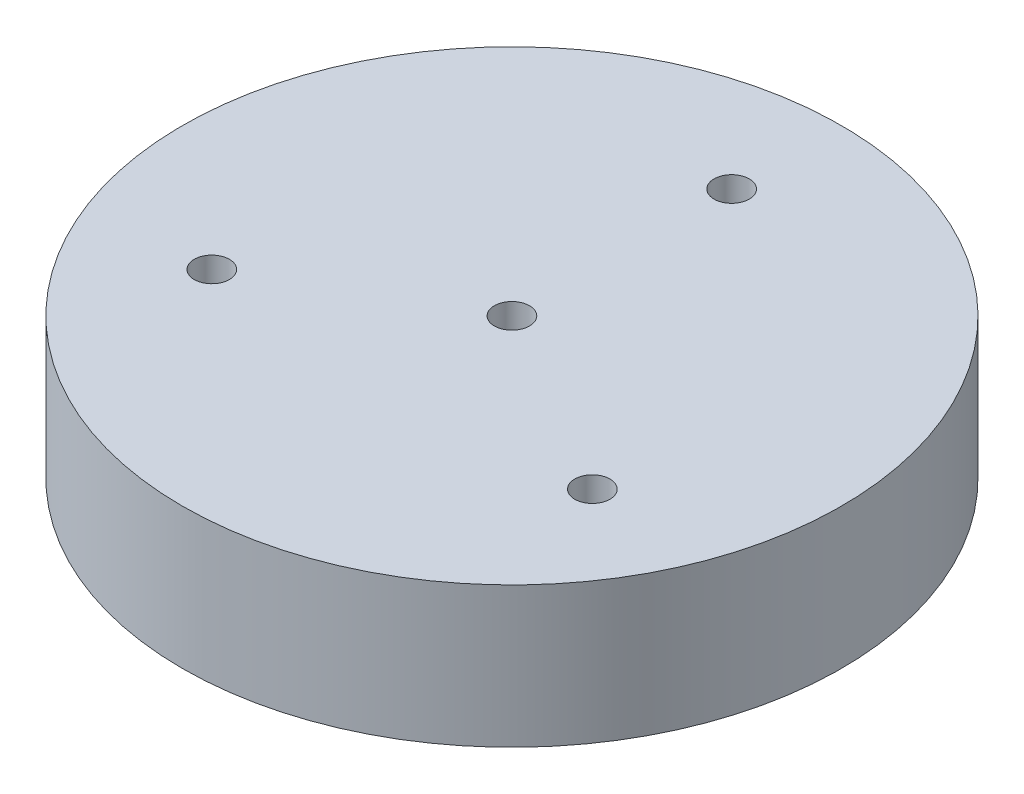
ISO-10303-21;
HEADER;
FILE_DESCRIPTION(('STEP AP214'),'2;1');
FILE_NAME('part.step','',(''),(''),'','','');
FILE_SCHEMA(('AUTOMOTIVE_DESIGN { 1 0 10303 214 1 1 1 1 }'));
ENDSEC;
DATA;
#1=APPLICATION_CONTEXT('core data for automotive mechanical design processes');
#2=APPLICATION_PROTOCOL_DEFINITION('international standard','automotive_design',2000,#1);
#3=PRODUCT_CONTEXT('',#1,'mechanical');
#4=PRODUCT('Part','Part','',(#3));
#5=PRODUCT_RELATED_PRODUCT_CATEGORY('part','',(#4));
#6=PRODUCT_DEFINITION_FORMATION('','',#4);
#7=PRODUCT_DEFINITION_CONTEXT('part definition',#1,'design');
#8=PRODUCT_DEFINITION('design','',#6,#7);
#9=PRODUCT_DEFINITION_SHAPE('','',#8);
#10=(LENGTH_UNIT() NAMED_UNIT(*) SI_UNIT(.MILLI.,.METRE.));
#11=(NAMED_UNIT(*) PLANE_ANGLE_UNIT() SI_UNIT($,.RADIAN.));
#12=(NAMED_UNIT(*) SI_UNIT($,.STERADIAN.) SOLID_ANGLE_UNIT());
#13=UNCERTAINTY_MEASURE_WITH_UNIT(LENGTH_MEASURE(1.E-05),#10,'distance_accuracy_value','');
#14=(GEOMETRIC_REPRESENTATION_CONTEXT(3) GLOBAL_UNCERTAINTY_ASSIGNED_CONTEXT((#13)) GLOBAL_UNIT_ASSIGNED_CONTEXT((#10,
#11,#12)) REPRESENTATION_CONTEXT('',''));
#15=CARTESIAN_POINT('',(0.,0.,0.));
#16=DIRECTION('',(0.,0.,1.));
#17=DIRECTION('',(1.,0.,0.));
#18=AXIS2_PLACEMENT_3D('',#15,#16,#17);
#19=CARTESIAN_POINT('',(0.,32.,0.));
#20=DIRECTION('',(0.,-1.,0.));
#21=DIRECTION('',(0.,0.,-1.));
#22=AXIS2_PLACEMENT_3D('',#19,#20,#21);
#23=CYLINDRICAL_SURFACE('',#22,75.);
#24=CARTESIAN_POINT('',(0.,32.,0.));
#25=DIRECTION('',(0.,1.,0.));
#26=DIRECTION('',(0.,0.,1.));
#27=AXIS2_PLACEMENT_3D('',#24,#25,#26);
#28=CIRCLE('',#27,75.);
#29=CARTESIAN_POINT('',(0.,32.,75.));
#30=VERTEX_POINT('',#29);
#31=EDGE_CURVE('E10',#30,#30,#28,.T.);
#32=ORIENTED_EDGE('',*,*,#31,.F.);
#33=EDGE_LOOP('',(#32));
#34=FACE_BOUND('',#33,.T.);
#35=CARTESIAN_POINT('',(0.,0.,0.));
#36=DIRECTION('',(0.,1.,0.));
#37=DIRECTION('',(0.,0.,1.));
#38=AXIS2_PLACEMENT_3D('',#35,#36,#37);
#39=CIRCLE('',#38,75.);
#40=CARTESIAN_POINT('',(0.,0.,75.));
#41=VERTEX_POINT('',#40);
#42=EDGE_CURVE('E39',#41,#41,#39,.T.);
#43=ORIENTED_EDGE('',*,*,#42,.T.);
#44=EDGE_LOOP('',(#43));
#45=FACE_BOUND('',#44,.T.);
#46=ADVANCED_FACE('F36',(#34,#45),#23,.T.);
#47=CARTESIAN_POINT('',(0.,32.,0.));
#48=DIRECTION('',(0.,1.,0.));
#49=DIRECTION('',(0.,0.,1.));
#50=AXIS2_PLACEMENT_3D('',#47,#48,#49);
#51=PLANE('',#50);
#52=CARTESIAN_POINT('',(0.,32.,0.));
#53=DIRECTION('',(0.,1.,0.));
#54=DIRECTION('',(0.,0.,1.));
#55=AXIS2_PLACEMENT_3D('',#52,#53,#54);
#56=CIRCLE('',#55,4.);
#57=CARTESIAN_POINT('',(0.,32.,4.));
#58=VERTEX_POINT('',#57);
#59=EDGE_CURVE('E71',#58,#58,#56,.T.);
#60=ORIENTED_EDGE('',*,*,#59,.F.);
#61=EDGE_LOOP('',(#60));
#62=FACE_BOUND('',#61,.T.);
#63=CARTESIAN_POINT('',(-43.3012701892222,32.,24.9999999999996));
#64=DIRECTION('',(0.,1.,0.));
#65=DIRECTION('',(0.866025403784443,0.,-0.499999999999992));
#66=AXIS2_PLACEMENT_3D('',#63,#64,#65);
#67=CIRCLE('',#66,4.);
#68=CARTESIAN_POINT('',(-39.8371685740844,32.,22.9999999999996));
#69=VERTEX_POINT('',#68);
#70=EDGE_CURVE('E65',#69,#69,#67,.T.);
#71=ORIENTED_EDGE('',*,*,#70,.F.);
#72=EDGE_LOOP('',(#71));
#73=FACE_BOUND('',#72,.T.);
#74=CARTESIAN_POINT('',(43.3012701892218,32.,25.0000000000002));
#75=DIRECTION('',(0.,1.,0.));
#76=DIRECTION('',(-0.866025403784436,0.,-0.500000000000004));
#77=AXIS2_PLACEMENT_3D('',#74,#75,#76);
#78=CIRCLE('',#77,4.);
#79=CARTESIAN_POINT('',(39.8371685740841,32.,23.0000000000002));
#80=VERTEX_POINT('',#79);
#81=EDGE_CURVE('E58',#80,#80,#78,.T.);
#82=ORIENTED_EDGE('',*,*,#81,.F.);
#83=EDGE_LOOP('',(#82));
#84=FACE_BOUND('',#83,.T.);
#85=CARTESIAN_POINT('',(0.,32.,-50.));
#86=DIRECTION('',(0.,1.,0.));
#87=DIRECTION('',(0.,0.,1.));
#88=AXIS2_PLACEMENT_3D('',#85,#86,#87);
#89=CIRCLE('',#88,4.);
#90=CARTESIAN_POINT('',(0.,32.,-46.));
#91=VERTEX_POINT('',#90);
#92=EDGE_CURVE('E52',#91,#91,#89,.T.);
#93=ORIENTED_EDGE('',*,*,#92,.F.);
#94=EDGE_LOOP('',(#93));
#95=FACE_BOUND('',#94,.T.);
#96=ORIENTED_EDGE('',*,*,#31,.T.);
#97=EDGE_LOOP('',(#96));
#98=FACE_BOUND('',#97,.T.);
#99=ADVANCED_FACE('F87',(#62,#73,#84,#95,#98),#51,.T.);
#100=CARTESIAN_POINT('',(0.,0.,0.));
#101=DIRECTION('',(0.,1.,0.));
#102=DIRECTION('',(0.,0.,1.));
#103=AXIS2_PLACEMENT_3D('',#100,#101,#102);
#104=PLANE('',#103);
#105=CARTESIAN_POINT('',(0.,0.,0.));
#106=DIRECTION('',(0.,1.,0.));
#107=DIRECTION('',(0.,0.,1.));
#108=AXIS2_PLACEMENT_3D('',#105,#106,#107);
#109=CIRCLE('',#108,4.);
#110=CARTESIAN_POINT('',(0.,0.,4.));
#111=VERTEX_POINT('',#110);
#112=EDGE_CURVE('E68',#111,#111,#109,.T.);
#113=ORIENTED_EDGE('',*,*,#112,.T.);
#114=EDGE_LOOP('',(#113));
#115=FACE_BOUND('',#114,.T.);
#116=CARTESIAN_POINT('',(-43.3012701892222,0.,24.9999999999996));
#117=DIRECTION('',(0.,1.,0.));
#118=DIRECTION('',(0.866025403784443,0.,-0.499999999999992));
#119=AXIS2_PLACEMENT_3D('',#116,#117,#118);
#120=CIRCLE('',#119,4.);
#121=CARTESIAN_POINT('',(-39.8371685740844,0.,22.9999999999996));
#122=VERTEX_POINT('',#121);
#123=EDGE_CURVE('E62',#122,#122,#120,.T.);
#124=ORIENTED_EDGE('',*,*,#123,.T.);
#125=EDGE_LOOP('',(#124));
#126=FACE_BOUND('',#125,.T.);
#127=CARTESIAN_POINT('',(43.3012701892218,0.,25.0000000000002));
#128=DIRECTION('',(0.,1.,0.));
#129=DIRECTION('',(-0.866025403784436,0.,-0.500000000000004));
#130=AXIS2_PLACEMENT_3D('',#127,#128,#129);
#131=CIRCLE('',#130,4.);
#132=CARTESIAN_POINT('',(39.8371685740841,0.,23.0000000000002));
#133=VERTEX_POINT('',#132);
#134=EDGE_CURVE('E55',#133,#133,#131,.T.);
#135=ORIENTED_EDGE('',*,*,#134,.T.);
#136=EDGE_LOOP('',(#135));
#137=FACE_BOUND('',#136,.T.);
#138=CARTESIAN_POINT('',(0.,0.,-50.));
#139=DIRECTION('',(0.,1.,0.));
#140=DIRECTION('',(0.,0.,1.));
#141=AXIS2_PLACEMENT_3D('',#138,#139,#140);
#142=CIRCLE('',#141,4.);
#143=CARTESIAN_POINT('',(0.,0.,-46.));
#144=VERTEX_POINT('',#143);
#145=EDGE_CURVE('E50',#144,#144,#142,.T.);
#146=ORIENTED_EDGE('',*,*,#145,.T.);
#147=EDGE_LOOP('',(#146));
#148=FACE_BOUND('',#147,.T.);
#149=ORIENTED_EDGE('',*,*,#42,.F.);
#150=EDGE_LOOP('',(#149));
#151=FACE_BOUND('',#150,.T.);
#152=ADVANCED_FACE('F77',(#115,#126,#137,#148,#151),#104,.F.);
#153=CARTESIAN_POINT('',(0.,0.,-50.));
#154=DIRECTION('',(0.,1.,0.));
#155=DIRECTION('',(0.,0.,1.));
#156=AXIS2_PLACEMENT_3D('',#153,#154,#155);
#157=CYLINDRICAL_SURFACE('',#156,4.);
#158=ORIENTED_EDGE('',*,*,#145,.F.);
#159=EDGE_LOOP('',(#158));
#160=FACE_BOUND('',#159,.T.);
#161=ORIENTED_EDGE('',*,*,#92,.T.);
#162=EDGE_LOOP('',(#161));
#163=FACE_BOUND('',#162,.T.);
#164=ADVANCED_FACE('F97',(#160,#163),#157,.F.);
#165=CARTESIAN_POINT('',(43.3012701892218,0.,25.0000000000002));
#166=DIRECTION('',(0.,1.,0.));
#167=DIRECTION('',(0.,0.,1.));
#168=AXIS2_PLACEMENT_3D('',#165,#166,#167);
#169=CYLINDRICAL_SURFACE('',#168,4.);
#170=ORIENTED_EDGE('',*,*,#134,.F.);
#171=EDGE_LOOP('',(#170));
#172=FACE_BOUND('',#171,.T.);
#173=ORIENTED_EDGE('',*,*,#81,.T.);
#174=EDGE_LOOP('',(#173));
#175=FACE_BOUND('',#174,.T.);
#176=ADVANCED_FACE('F99',(#172,#175),#169,.F.);
#177=CARTESIAN_POINT('',(-43.3012701892222,0.,24.9999999999996));
#178=DIRECTION('',(0.,1.,0.));
#179=DIRECTION('',(0.,0.,1.));
#180=AXIS2_PLACEMENT_3D('',#177,#178,#179);
#181=CYLINDRICAL_SURFACE('',#180,4.);
#182=ORIENTED_EDGE('',*,*,#123,.F.);
#183=EDGE_LOOP('',(#182));
#184=FACE_BOUND('',#183,.T.);
#185=ORIENTED_EDGE('',*,*,#70,.T.);
#186=EDGE_LOOP('',(#185));
#187=FACE_BOUND('',#186,.T.);
#188=ADVANCED_FACE('F83',(#184,#187),#181,.F.);
#189=CARTESIAN_POINT('',(0.,0.,0.));
#190=DIRECTION('',(0.,1.,0.));
#191=DIRECTION('',(0.,0.,1.));
#192=AXIS2_PLACEMENT_3D('',#189,#190,#191);
#193=CYLINDRICAL_SURFACE('',#192,4.);
#194=ORIENTED_EDGE('',*,*,#112,.F.);
#195=EDGE_LOOP('',(#194));
#196=FACE_BOUND('',#195,.T.);
#197=ORIENTED_EDGE('',*,*,#59,.T.);
#198=EDGE_LOOP('',(#197));
#199=FACE_BOUND('',#198,.T.);
#200=ADVANCED_FACE('F80',(#196,#199),#193,.F.);
#201=CLOSED_SHELL('',(#46,#99,#152,#164,#176,#188,#200));
#202=MANIFOLD_SOLID_BREP('B2',#201);
#203=ADVANCED_BREP_SHAPE_REPRESENTATION('',(#18,#202),#14);
#204=SHAPE_DEFINITION_REPRESENTATION(#9,#203);
ENDSEC;
END-ISO-10303-21;
